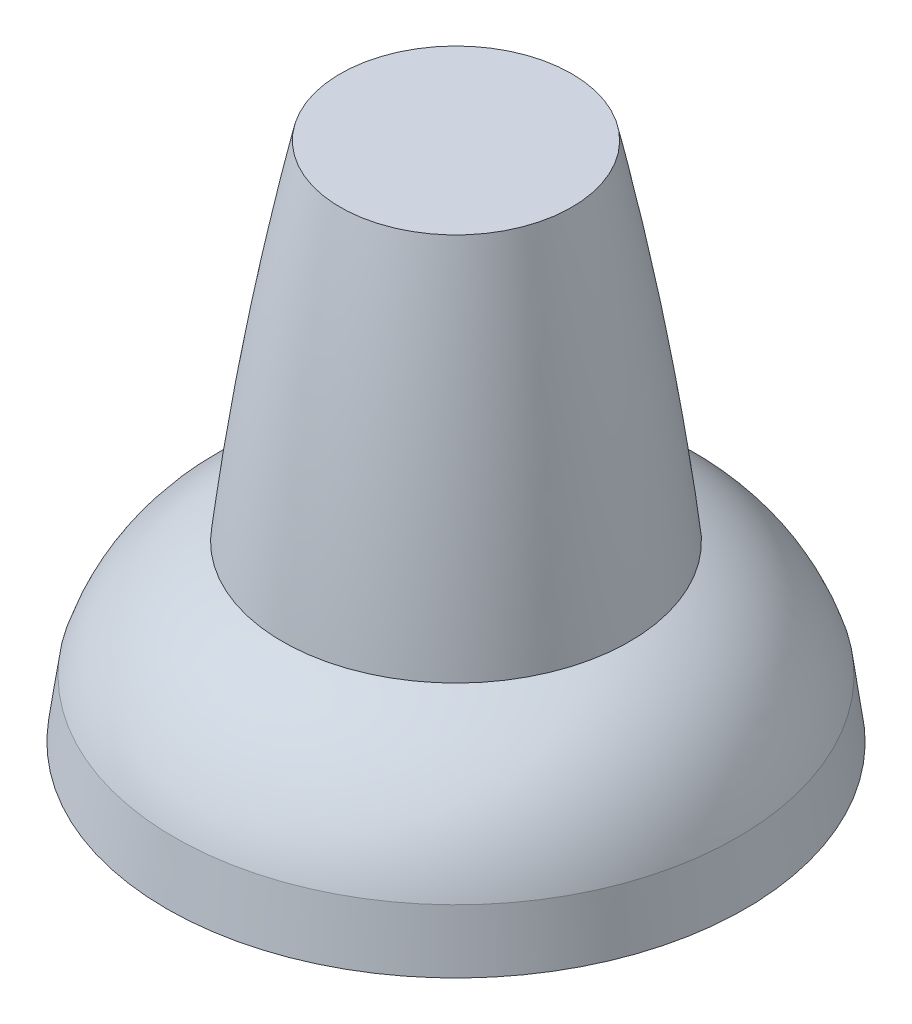
ISO-10303-21;
HEADER;
FILE_DESCRIPTION(('STEP AP214'),'2;1');
FILE_NAME('part.step','',(''),(''),'','','');
FILE_SCHEMA(('AUTOMOTIVE_DESIGN { 1 0 10303 214 1 1 1 1 }'));
ENDSEC;
DATA;
#1=APPLICATION_CONTEXT('core data for automotive mechanical design processes');
#2=APPLICATION_PROTOCOL_DEFINITION('international standard','automotive_design',2000,#1);
#3=PRODUCT_CONTEXT('',#1,'mechanical');
#4=PRODUCT('Part','Part','',(#3));
#5=PRODUCT_RELATED_PRODUCT_CATEGORY('part','',(#4));
#6=PRODUCT_DEFINITION_FORMATION('','',#4);
#7=PRODUCT_DEFINITION_CONTEXT('part definition',#1,'design');
#8=PRODUCT_DEFINITION('design','',#6,#7);
#9=PRODUCT_DEFINITION_SHAPE('','',#8);
#10=(LENGTH_UNIT() NAMED_UNIT(*) SI_UNIT(.MILLI.,.METRE.));
#11=(NAMED_UNIT(*) PLANE_ANGLE_UNIT() SI_UNIT($,.RADIAN.));
#12=(NAMED_UNIT(*) SI_UNIT($,.STERADIAN.) SOLID_ANGLE_UNIT());
#13=UNCERTAINTY_MEASURE_WITH_UNIT(LENGTH_MEASURE(1.E-05),#10,'distance_accuracy_value','');
#14=(GEOMETRIC_REPRESENTATION_CONTEXT(3) GLOBAL_UNCERTAINTY_ASSIGNED_CONTEXT((#13)) GLOBAL_UNIT_ASSIGNED_CONTEXT((#10,
#11,#12)) REPRESENTATION_CONTEXT('',''));
#15=CARTESIAN_POINT('',(0.,0.,0.));
#16=DIRECTION('',(0.,0.,1.));
#17=DIRECTION('',(1.,0.,0.));
#18=AXIS2_PLACEMENT_3D('',#15,#16,#17);
#19=CARTESIAN_POINT('',(0.,0.,0.));
#20=DIRECTION('',(0.,-1.,0.));
#21=DIRECTION('',(0.,0.,-1.));
#22=AXIS2_PLACEMENT_3D('',#19,#20,#21);
#23=PLANE('',#22);
#24=CARTESIAN_POINT('',(0.,0.,0.));
#25=DIRECTION('',(0.,-1.,0.));
#26=DIRECTION('',(0.,0.,-1.));
#27=AXIS2_PLACEMENT_3D('',#24,#25,#26);
#28=CIRCLE('',#27,25.);
#29=CARTESIAN_POINT('',(0.,0.,-25.));
#30=VERTEX_POINT('',#29);
#31=EDGE_CURVE('E58',#30,#30,#28,.T.);
#32=ORIENTED_EDGE('',*,*,#31,.T.);
#33=EDGE_LOOP('',(#32));
#34=FACE_BOUND('',#33,.T.);
#35=ADVANCED_FACE('F44',(#34),#23,.T.);
#36=CARTESIAN_POINT('',(0.,45.0000000000001,0.));
#37=DIRECTION('',(0.,1.,0.));
#38=DIRECTION('',(0.,0.,1.));
#39=AXIS2_PLACEMENT_3D('',#36,#37,#38);
#40=PLANE('',#39);
#41=CARTESIAN_POINT('',(0.,45.0000000000001,0.));
#42=DIRECTION('',(0.,-1.,0.));
#43=DIRECTION('',(0.,0.,-1.));
#44=AXIS2_PLACEMENT_3D('',#41,#42,#43);
#45=CIRCLE('',#44,10.);
#46=CARTESIAN_POINT('',(0.,45.0000000000001,-9.99999999999999));
#47=VERTEX_POINT('',#46);
#48=EDGE_CURVE('E12',#47,#47,#45,.T.);
#49=ORIENTED_EDGE('',*,*,#48,.F.);
#50=EDGE_LOOP('',(#49));
#51=FACE_BOUND('',#50,.T.);
#52=ADVANCED_FACE('F78',(#51),#40,.T.);
#53=CARTESIAN_POINT('',(15.,14.9999999999999,0.));
#54=CARTESIAN_POINT('',(13.2803082851302,30.1288635519363,0.));
#55=CARTESIAN_POINT('',(9.9999999999999,45.,0.));
#56=B_SPLINE_CURVE_WITH_KNOTS('',2,(#53,#54,#55),.UNSPECIFIED.,.F.,.F.,(3,3),(0.,1.),.UNSPECIFIED.);
#57=CARTESIAN_POINT('',(-1.11022302462516E-13,15.0000000000001,0.));
#58=DIRECTION('',(0.,-1.,0.));
#59=AXIS1_PLACEMENT('',#57,#58);
#60=SURFACE_OF_REVOLUTION('',#56,#59);
#61=ORIENTED_EDGE('',*,*,#48,.T.);
#62=EDGE_LOOP('',(#61));
#63=FACE_BOUND('',#62,.T.);
#64=CARTESIAN_POINT('',(-1.11022302462516E-13,15.0000000000001,0.));
#65=DIRECTION('',(0.,-1.,0.));
#66=DIRECTION('',(0.,0.,-1.));
#67=AXIS2_PLACEMENT_3D('',#64,#65,#66);
#68=CIRCLE('',#67,15.);
#69=CARTESIAN_POINT('',(-1.11646802913867E-13,15.0000000000001,-15.));
#70=VERTEX_POINT('',#69);
#71=EDGE_CURVE('E50',#70,#70,#68,.T.);
#72=ORIENTED_EDGE('',*,*,#71,.F.);
#73=EDGE_LOOP('',(#72));
#74=FACE_BOUND('',#73,.T.);
#75=ADVANCED_FACE('F74',(#63,#74),#60,.F.);
#76=CARTESIAN_POINT('',(24.3205645204187,5.,0.));
#77=CARTESIAN_POINT('',(22.0633537641434,12.1407194371833,0.));
#78=CARTESIAN_POINT('',(15.,14.9999999999999,0.));
#79=B_SPLINE_CURVE_WITH_KNOTS('',2,(#76,#77,#78),.UNSPECIFIED.,.F.,.F.,(3,3),(0.,1.),.UNSPECIFIED.);
#80=CARTESIAN_POINT('',(-1.11022302462516E-13,15.0000000000001,0.));
#81=DIRECTION('',(0.,-1.,0.));
#82=AXIS1_PLACEMENT('',#80,#81);
#83=SURFACE_OF_REVOLUTION('',#79,#82);
#84=ORIENTED_EDGE('',*,*,#71,.T.);
#85=EDGE_LOOP('',(#84));
#86=FACE_BOUND('',#85,.T.);
#87=CARTESIAN_POINT('',(-1.11022302462516E-13,5.00000000000006,0.));
#88=DIRECTION('',(0.,-1.,0.));
#89=DIRECTION('',(0.,0.,-1.));
#90=AXIS2_PLACEMENT_3D('',#87,#88,#89);
#91=CIRCLE('',#90,24.3205645204187);
#92=CARTESIAN_POINT('',(-1.12034849363858E-13,5.00000000000006,-24.3205645204187));
#93=VERTEX_POINT('',#92);
#94=EDGE_CURVE('E54',#93,#93,#91,.T.);
#95=ORIENTED_EDGE('',*,*,#94,.F.);
#96=EDGE_LOOP('',(#95));
#97=FACE_BOUND('',#96,.T.);
#98=ADVANCED_FACE('F77',(#86,#97),#83,.F.);
#99=CARTESIAN_POINT('',(0.,0.,0.));
#100=DIRECTION('',(0.,-1.,0.));
#101=DIRECTION('',(0.,0.,-1.));
#102=AXIS2_PLACEMENT_3D('',#99,#100,#101);
#103=CONICAL_SURFACE('',#102,25.,0.135059843245099);
#104=ORIENTED_EDGE('',*,*,#94,.T.);
#105=EDGE_LOOP('',(#104));
#106=FACE_BOUND('',#105,.T.);
#107=ORIENTED_EDGE('',*,*,#31,.F.);
#108=EDGE_LOOP('',(#107));
#109=FACE_BOUND('',#108,.T.);
#110=ADVANCED_FACE('F90',(#106,#109),#103,.T.);
#111=CLOSED_SHELL('',(#35,#52,#75,#98,#110));
#112=MANIFOLD_SOLID_BREP('B2',#111);
#113=ADVANCED_BREP_SHAPE_REPRESENTATION('',(#18,#112),#14);
#114=SHAPE_DEFINITION_REPRESENTATION(#9,#113);
ENDSEC;
END-ISO-10303-21;
